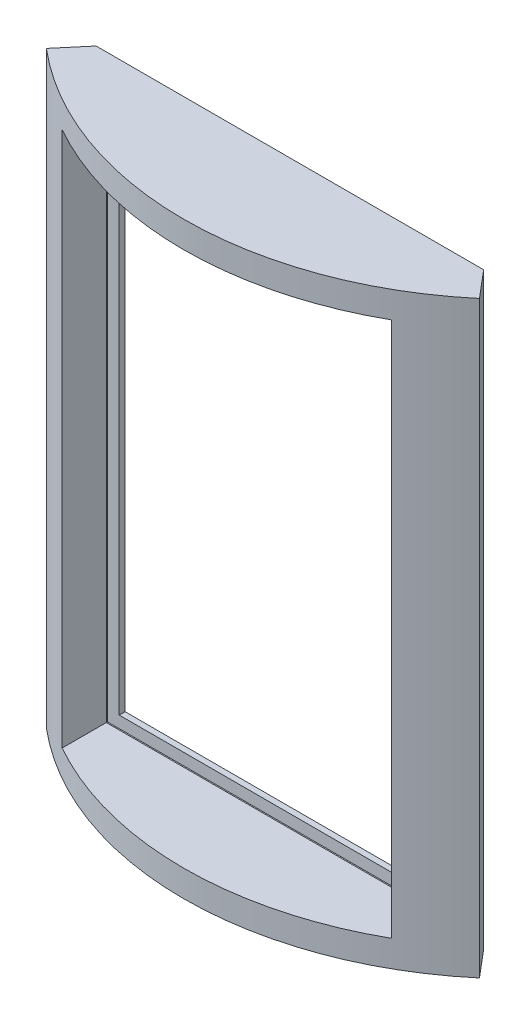
ISO-10303-21;
HEADER;
FILE_DESCRIPTION(('STEP AP214'),'2;1');
FILE_NAME('part.step','',(''),(''),'','','');
FILE_SCHEMA(('AUTOMOTIVE_DESIGN { 1 0 10303 214 1 1 1 1 }'));
ENDSEC;
DATA;
#1=APPLICATION_CONTEXT('core data for automotive mechanical design processes');
#2=APPLICATION_PROTOCOL_DEFINITION('international standard','automotive_design',2000,#1);
#3=PRODUCT_CONTEXT('',#1,'mechanical');
#4=PRODUCT('Part','Part','',(#3));
#5=PRODUCT_RELATED_PRODUCT_CATEGORY('part','',(#4));
#6=PRODUCT_DEFINITION_FORMATION('','',#4);
#7=PRODUCT_DEFINITION_CONTEXT('part definition',#1,'design');
#8=PRODUCT_DEFINITION('design','',#6,#7);
#9=PRODUCT_DEFINITION_SHAPE('','',#8);
#10=(LENGTH_UNIT() NAMED_UNIT(*) SI_UNIT(.MILLI.,.METRE.));
#11=(NAMED_UNIT(*) PLANE_ANGLE_UNIT() SI_UNIT($,.RADIAN.));
#12=(NAMED_UNIT(*) SI_UNIT($,.STERADIAN.) SOLID_ANGLE_UNIT());
#13=UNCERTAINTY_MEASURE_WITH_UNIT(LENGTH_MEASURE(1.E-05),#10,'distance_accuracy_value','');
#14=(GEOMETRIC_REPRESENTATION_CONTEXT(3) GLOBAL_UNCERTAINTY_ASSIGNED_CONTEXT((#13)) GLOBAL_UNIT_ASSIGNED_CONTEXT((#10,
#11,#12)) REPRESENTATION_CONTEXT('',''));
#15=CARTESIAN_POINT('',(0.,0.,0.));
#16=DIRECTION('',(0.,0.,1.));
#17=DIRECTION('',(1.,0.,0.));
#18=AXIS2_PLACEMENT_3D('',#15,#16,#17);
#19=CARTESIAN_POINT('',(-28.,-45.5,57.));
#20=DIRECTION('',(-1.,0.,0.));
#21=DIRECTION('',(0.,0.,1.));
#22=AXIS2_PLACEMENT_3D('',#19,#20,#21);
#23=PLANE('',#22);
#24=DIRECTION('',(0.,1.,0.));
#25=VECTOR('',#24,1.);
#26=CARTESIAN_POINT('',(-28.,-45.5,39.9492510220167));
#27=LINE('',#26,#25);
#28=CARTESIAN_POINT('',(-28.,-45.5,39.9492510220167));
#29=VERTEX_POINT('',#28);
#30=CARTESIAN_POINT('',(-28.,45.5,39.9492510220167));
#31=VERTEX_POINT('',#30);
#32=EDGE_CURVE('E61',#29,#31,#27,.T.);
#33=ORIENTED_EDGE('',*,*,#32,.F.);
#34=DIRECTION('',(0.,0.,-1.));
#35=VECTOR('',#34,1.);
#36=CARTESIAN_POINT('',(-28.,-45.5,57.));
#37=LINE('',#36,#35);
#38=CARTESIAN_POINT('',(-28.,-45.5,38.9492510220167));
#39=VERTEX_POINT('',#38);
#40=EDGE_CURVE('E245',#29,#39,#37,.T.);
#41=ORIENTED_EDGE('',*,*,#40,.T.);
#42=DIRECTION('',(0.,1.,0.));
#43=VECTOR('',#42,1.);
#44=CARTESIAN_POINT('',(-28.,-45.5,38.9492510220167));
#45=LINE('',#44,#43);
#46=CARTESIAN_POINT('',(-28.,45.5,38.9492510220167));
#47=VERTEX_POINT('',#46);
#48=EDGE_CURVE('E223',#39,#47,#45,.T.);
#49=ORIENTED_EDGE('',*,*,#48,.T.);
#50=DIRECTION('',(0.,0.,-1.));
#51=VECTOR('',#50,1.);
#52=CARTESIAN_POINT('',(-28.,45.5,57.));
#53=LINE('',#52,#51);
#54=EDGE_CURVE('E239',#31,#47,#53,.T.);
#55=ORIENTED_EDGE('',*,*,#54,.F.);
#56=EDGE_LOOP('',(#33,#41,#49,#55));
#57=FACE_BOUND('',#56,.T.);
#58=ADVANCED_FACE('F38',(#57),#23,.F.);
#59=CARTESIAN_POINT('',(28.,-45.5,57.));
#60=DIRECTION('',(0.,-1.,0.));
#61=DIRECTION('',(0.,0.,-1.));
#62=AXIS2_PLACEMENT_3D('',#59,#60,#61);
#63=PLANE('',#62);
#64=DIRECTION('',(-1.,0.,0.));
#65=VECTOR('',#64,1.);
#66=CARTESIAN_POINT('',(28.,-45.5,39.9492510220167));
#67=LINE('',#66,#65);
#68=CARTESIAN_POINT('',(28.,-45.5,39.9492510220167));
#69=VERTEX_POINT('',#68);
#70=EDGE_CURVE('E208',#69,#29,#67,.T.);
#71=ORIENTED_EDGE('',*,*,#70,.F.);
#72=DIRECTION('',(0.,0.,-1.));
#73=VECTOR('',#72,1.);
#74=CARTESIAN_POINT('',(28.,-45.5,57.));
#75=LINE('',#74,#73);
#76=CARTESIAN_POINT('',(28.,-45.5,38.9492510220167));
#77=VERTEX_POINT('',#76);
#78=EDGE_CURVE('E250',#69,#77,#75,.T.);
#79=ORIENTED_EDGE('',*,*,#78,.T.);
#80=DIRECTION('',(-1.,0.,0.));
#81=VECTOR('',#80,1.);
#82=CARTESIAN_POINT('',(28.,-45.5,38.9492510220167));
#83=LINE('',#82,#81);
#84=EDGE_CURVE('E235',#77,#39,#83,.T.);
#85=ORIENTED_EDGE('',*,*,#84,.T.);
#86=ORIENTED_EDGE('',*,*,#40,.F.);
#87=EDGE_LOOP('',(#71,#79,#85,#86));
#88=FACE_BOUND('',#87,.T.);
#89=ADVANCED_FACE('F338',(#88),#63,.F.);
#90=CARTESIAN_POINT('',(28.,-45.5,57.));
#91=DIRECTION('',(1.,0.,0.));
#92=DIRECTION('',(0.,0.,-1.));
#93=AXIS2_PLACEMENT_3D('',#90,#91,#92);
#94=PLANE('',#93);
#95=DIRECTION('',(0.,-1.,0.));
#96=VECTOR('',#95,1.);
#97=CARTESIAN_POINT('',(28.,-45.5,39.9492510220167));
#98=LINE('',#97,#96);
#99=CARTESIAN_POINT('',(28.,45.5,39.9492510220167));
#100=VERTEX_POINT('',#99);
#101=EDGE_CURVE('E200',#100,#69,#98,.T.);
#102=ORIENTED_EDGE('',*,*,#101,.F.);
#103=DIRECTION('',(0.,0.,-1.));
#104=VECTOR('',#103,1.);
#105=CARTESIAN_POINT('',(28.,45.5,57.));
#106=LINE('',#105,#104);
#107=CARTESIAN_POINT('',(28.,45.5,38.9492510220167));
#108=VERTEX_POINT('',#107);
#109=EDGE_CURVE('E255',#100,#108,#106,.T.);
#110=ORIENTED_EDGE('',*,*,#109,.T.);
#111=DIRECTION('',(0.,-1.,0.));
#112=VECTOR('',#111,1.);
#113=CARTESIAN_POINT('',(28.,-45.5,38.9492510220167));
#114=LINE('',#113,#112);
#115=EDGE_CURVE('E231',#108,#77,#114,.T.);
#116=ORIENTED_EDGE('',*,*,#115,.T.);
#117=ORIENTED_EDGE('',*,*,#78,.F.);
#118=EDGE_LOOP('',(#102,#110,#116,#117));
#119=FACE_BOUND('',#118,.T.);
#120=ADVANCED_FACE('F323',(#119),#94,.F.);
#121=CARTESIAN_POINT('',(28.,45.5,57.));
#122=DIRECTION('',(0.,1.,0.));
#123=DIRECTION('',(0.,0.,1.));
#124=AXIS2_PLACEMENT_3D('',#121,#122,#123);
#125=PLANE('',#124);
#126=DIRECTION('',(1.,0.,0.));
#127=VECTOR('',#126,1.);
#128=CARTESIAN_POINT('',(28.,45.5,39.9492510220167));
#129=LINE('',#128,#127);
#130=EDGE_CURVE('E47',#31,#100,#129,.T.);
#131=ORIENTED_EDGE('',*,*,#130,.F.);
#132=ORIENTED_EDGE('',*,*,#54,.T.);
#133=DIRECTION('',(1.,0.,0.));
#134=VECTOR('',#133,1.);
#135=CARTESIAN_POINT('',(28.,45.5,38.9492510220167));
#136=LINE('',#135,#134);
#137=EDGE_CURVE('E227',#47,#108,#136,.T.);
#138=ORIENTED_EDGE('',*,*,#137,.T.);
#139=ORIENTED_EDGE('',*,*,#109,.F.);
#140=EDGE_LOOP('',(#131,#132,#138,#139));
#141=FACE_BOUND('',#140,.T.);
#142=ADVANCED_FACE('F324',(#141),#125,.F.);
#143=CARTESIAN_POINT('',(0.,50.,0.));
#144=DIRECTION('',(0.,-1.,0.));
#145=DIRECTION('',(0.,0.,-1.));
#146=AXIS2_PLACEMENT_3D('',#143,#144,#145);
#147=CYLINDRICAL_SURFACE('',#146,57.);
#148=DIRECTION('',(0.,-1.,0.));
#149=VECTOR('',#148,1.);
#150=CARTESIAN_POINT('',(28.,50.,49.6487663492256));
#151=LINE('',#150,#149);
#152=CARTESIAN_POINT('',(28.,45.5,49.6487663492256));
#153=VERTEX_POINT('',#152);
#154=CARTESIAN_POINT('',(28.,-45.5,49.6487663492256));
#155=VERTEX_POINT('',#154);
#156=EDGE_CURVE('E262',#153,#155,#151,.T.);
#157=ORIENTED_EDGE('',*,*,#156,.T.);
#158=CARTESIAN_POINT('',(0.,-45.5,0.));
#159=DIRECTION('',(0.,-1.,0.));
#160=DIRECTION('',(0.,0.,-1.));
#161=AXIS2_PLACEMENT_3D('',#158,#159,#160);
#162=CIRCLE('',#161,57.);
#163=CARTESIAN_POINT('',(-28.,-45.5,49.6487663492257));
#164=VERTEX_POINT('',#163);
#165=EDGE_CURVE('E266',#155,#164,#162,.T.);
#166=ORIENTED_EDGE('',*,*,#165,.T.);
#167=DIRECTION('',(0.,-1.,0.));
#168=VECTOR('',#167,1.);
#169=CARTESIAN_POINT('',(-28.,50.,49.6487663492257));
#170=LINE('',#169,#168);
#171=CARTESIAN_POINT('',(-28.,45.5,49.6487663492257));
#172=VERTEX_POINT('',#171);
#173=EDGE_CURVE('E269',#164,#172,#170,.F.);
#174=ORIENTED_EDGE('',*,*,#173,.T.);
#175=CARTESIAN_POINT('',(0.,45.5,0.));
#176=DIRECTION('',(0.,1.,0.));
#177=DIRECTION('',(0.,0.,1.));
#178=AXIS2_PLACEMENT_3D('',#175,#176,#177);
#179=CIRCLE('',#178,57.);
#180=EDGE_CURVE('E244',#172,#153,#179,.T.);
#181=ORIENTED_EDGE('',*,*,#180,.T.);
#182=EDGE_LOOP('',(#157,#166,#174,#181));
#183=FACE_BOUND('',#182,.T.);
#184=CARTESIAN_POINT('',(0.,-50.,0.));
#185=DIRECTION('',(0.,1.,0.));
#186=DIRECTION('',(0.,0.,1.));
#187=AXIS2_PLACEMENT_3D('',#184,#185,#186);
#188=CIRCLE('',#187,57.);
#189=CARTESIAN_POINT('',(-36.7968358417331,-50.,43.5315158481363));
#190=VERTEX_POINT('',#189);
#191=CARTESIAN_POINT('',(36.7968358417331,-50.,43.5315158481363));
#192=VERTEX_POINT('',#191);
#193=EDGE_CURVE('E273',#190,#192,#188,.T.);
#194=ORIENTED_EDGE('',*,*,#193,.T.);
#195=DIRECTION('',(0.,-1.,0.));
#196=VECTOR('',#195,1.);
#197=CARTESIAN_POINT('',(36.7968358417331,50.,43.5315158481363));
#198=LINE('',#197,#196);
#199=CARTESIAN_POINT('',(36.7968358417331,50.,43.5315158481363));
#200=VERTEX_POINT('',#199);
#201=EDGE_CURVE('E311',#200,#192,#198,.T.);
#202=ORIENTED_EDGE('',*,*,#201,.F.);
#203=CARTESIAN_POINT('',(0.,50.,0.));
#204=DIRECTION('',(0.,1.,0.));
#205=DIRECTION('',(0.,0.,1.));
#206=AXIS2_PLACEMENT_3D('',#203,#204,#205);
#207=CIRCLE('',#206,57.);
#208=CARTESIAN_POINT('',(-36.7968358417331,50.,43.5315158481363));
#209=VERTEX_POINT('',#208);
#210=EDGE_CURVE('E274',#209,#200,#207,.T.);
#211=ORIENTED_EDGE('',*,*,#210,.F.);
#212=DIRECTION('',(0.,-1.,0.));
#213=VECTOR('',#212,1.);
#214=CARTESIAN_POINT('',(-36.7968358417331,50.,43.5315158481363));
#215=LINE('',#214,#213);
#216=EDGE_CURVE('E288',#209,#190,#215,.T.);
#217=ORIENTED_EDGE('',*,*,#216,.T.);
#218=EDGE_LOOP('',(#194,#202,#211,#217));
#219=FACE_BOUND('',#218,.T.);
#220=ADVANCED_FACE('F40',(#183,#219),#147,.T.);
#221=CARTESIAN_POINT('',(32.9234847004981,50.,38.9492510220167));
#222=DIRECTION('',(-0.763710804353268,0.,0.645558523539179));
#223=DIRECTION('',(0.645558523539179,0.,0.763710804353268));
#224=AXIS2_PLACEMENT_3D('',#221,#222,#223);
#225=PLANE('',#224);
#226=DIRECTION('',(-0.645558523539179,0.,-0.763710804353267));
#227=VECTOR('',#226,1.);
#228=CARTESIAN_POINT('',(32.9234847004981,-50.,38.9492510220167));
#229=LINE('',#228,#227);
#230=CARTESIAN_POINT('',(32.9234847004981,-50.,38.9492510220167));
#231=VERTEX_POINT('',#230);
#232=EDGE_CURVE('E292',#192,#231,#229,.T.);
#233=ORIENTED_EDGE('',*,*,#232,.T.);
#234=DIRECTION('',(0.,-1.,0.));
#235=VECTOR('',#234,1.);
#236=CARTESIAN_POINT('',(32.9234847004981,50.,38.9492510220167));
#237=LINE('',#236,#235);
#238=CARTESIAN_POINT('',(32.9234847004981,50.,38.9492510220167));
#239=VERTEX_POINT('',#238);
#240=EDGE_CURVE('E307',#239,#231,#237,.T.);
#241=ORIENTED_EDGE('',*,*,#240,.F.);
#242=DIRECTION('',(-0.645558523539179,0.,-0.763710804353267));
#243=VECTOR('',#242,1.);
#244=CARTESIAN_POINT('',(32.9234847004981,50.,38.9492510220167));
#245=LINE('',#244,#243);
#246=EDGE_CURVE('E278',#200,#239,#245,.T.);
#247=ORIENTED_EDGE('',*,*,#246,.F.);
#248=ORIENTED_EDGE('',*,*,#201,.T.);
#249=EDGE_LOOP('',(#233,#241,#247,#248));
#250=FACE_BOUND('',#249,.T.);
#251=ADVANCED_FACE('F498',(#250),#225,.F.);
#252=CARTESIAN_POINT('',(-32.9234847004981,50.,38.9492510220167));
#253=DIRECTION('',(0.,0.,1.));
#254=DIRECTION('',(1.,0.,0.));
#255=AXIS2_PLACEMENT_3D('',#252,#253,#254);
#256=PLANE('',#255);
#257=ORIENTED_EDGE('',*,*,#137,.F.);
#258=ORIENTED_EDGE('',*,*,#48,.F.);
#259=ORIENTED_EDGE('',*,*,#84,.F.);
#260=ORIENTED_EDGE('',*,*,#115,.F.);
#261=EDGE_LOOP('',(#257,#258,#259,#260));
#262=FACE_BOUND('',#261,.T.);
#263=DIRECTION('',(-1.,0.,0.));
#264=VECTOR('',#263,1.);
#265=CARTESIAN_POINT('',(-32.9234847004981,-50.,38.9492510220167));
#266=LINE('',#265,#264);
#267=CARTESIAN_POINT('',(-32.9234847004981,-50.,38.9492510220167));
#268=VERTEX_POINT('',#267);
#269=EDGE_CURVE('E295',#231,#268,#266,.T.);
#270=ORIENTED_EDGE('',*,*,#269,.T.);
#271=DIRECTION('',(0.,-1.,0.));
#272=VECTOR('',#271,1.);
#273=CARTESIAN_POINT('',(-32.9234847004981,50.,38.9492510220167));
#274=LINE('',#273,#272);
#275=CARTESIAN_POINT('',(-32.9234847004981,50.,38.9492510220167));
#276=VERTEX_POINT('',#275);
#277=EDGE_CURVE('E303',#276,#268,#274,.T.);
#278=ORIENTED_EDGE('',*,*,#277,.F.);
#279=DIRECTION('',(-1.,0.,0.));
#280=VECTOR('',#279,1.);
#281=CARTESIAN_POINT('',(-32.9234847004981,50.,38.9492510220167));
#282=LINE('',#281,#280);
#283=EDGE_CURVE('E282',#239,#276,#282,.T.);
#284=ORIENTED_EDGE('',*,*,#283,.F.);
#285=ORIENTED_EDGE('',*,*,#240,.T.);
#286=EDGE_LOOP('',(#270,#278,#284,#285));
#287=FACE_BOUND('',#286,.T.);
#288=ADVANCED_FACE('F335',(#262,#287),#256,.F.);
#289=CARTESIAN_POINT('',(-36.7968358417331,50.,43.5315158481363));
#290=DIRECTION('',(0.763710804353269,0.,0.645558523539178));
#291=DIRECTION('',(0.645558523539178,0.,-0.763710804353269));
#292=AXIS2_PLACEMENT_3D('',#289,#290,#291);
#293=PLANE('',#292);
#294=DIRECTION('',(-0.645558523539178,0.,0.763710804353269));
#295=VECTOR('',#294,1.);
#296=CARTESIAN_POINT('',(-36.7968358417331,-50.,43.5315158481363));
#297=LINE('',#296,#295);
#298=EDGE_CURVE('E279',#268,#190,#297,.T.);
#299=ORIENTED_EDGE('',*,*,#298,.T.);
#300=ORIENTED_EDGE('',*,*,#216,.F.);
#301=DIRECTION('',(-0.645558523539178,0.,0.763710804353269));
#302=VECTOR('',#301,1.);
#303=CARTESIAN_POINT('',(-36.7968358417331,50.,43.5315158481363));
#304=LINE('',#303,#302);
#305=EDGE_CURVE('E285',#276,#209,#304,.T.);
#306=ORIENTED_EDGE('',*,*,#305,.F.);
#307=ORIENTED_EDGE('',*,*,#277,.T.);
#308=EDGE_LOOP('',(#299,#300,#306,#307));
#309=FACE_BOUND('',#308,.T.);
#310=ADVANCED_FACE('F481',(#309),#293,.F.);
#311=CARTESIAN_POINT('',(0.,50.,0.));
#312=DIRECTION('',(0.,1.,0.));
#313=DIRECTION('',(0.,0.,1.));
#314=AXIS2_PLACEMENT_3D('',#311,#312,#313);
#315=PLANE('',#314);
#316=ORIENTED_EDGE('',*,*,#210,.T.);
#317=ORIENTED_EDGE('',*,*,#246,.T.);
#318=ORIENTED_EDGE('',*,*,#283,.T.);
#319=ORIENTED_EDGE('',*,*,#305,.T.);
#320=EDGE_LOOP('',(#316,#317,#318,#319));
#321=FACE_BOUND('',#320,.T.);
#322=ADVANCED_FACE('F471',(#321),#315,.T.);
#323=CARTESIAN_POINT('',(0.,-50.,0.));
#324=DIRECTION('',(0.,1.,0.));
#325=DIRECTION('',(0.,0.,1.));
#326=AXIS2_PLACEMENT_3D('',#323,#324,#325);
#327=PLANE('',#326);
#328=ORIENTED_EDGE('',*,*,#193,.F.);
#329=ORIENTED_EDGE('',*,*,#298,.F.);
#330=ORIENTED_EDGE('',*,*,#269,.F.);
#331=ORIENTED_EDGE('',*,*,#232,.F.);
#332=EDGE_LOOP('',(#328,#329,#330,#331));
#333=FACE_BOUND('',#332,.T.);
#334=ADVANCED_FACE('F360',(#333),#327,.F.);
#335=CARTESIAN_POINT('',(-28.,-45.5,42.1492510220167));
#336=VERTEX_POINT('',#335);
#337=EDGE_CURVE('E240',#164,#336,#37,.T.);
#338=ORIENTED_EDGE('',*,*,#337,.T.);
#339=DIRECTION('',(0.,1.,0.));
#340=VECTOR('',#339,1.);
#341=CARTESIAN_POINT('',(-28.,-45.5,42.1492510220167));
#342=LINE('',#341,#340);
#343=CARTESIAN_POINT('',(-28.,45.5,42.1492510220167));
#344=VERTEX_POINT('',#343);
#345=EDGE_CURVE('E219',#336,#344,#342,.T.);
#346=ORIENTED_EDGE('',*,*,#345,.T.);
#347=EDGE_CURVE('E256',#172,#344,#53,.T.);
#348=ORIENTED_EDGE('',*,*,#347,.F.);
#349=ORIENTED_EDGE('',*,*,#173,.F.);
#350=EDGE_LOOP('',(#338,#346,#348,#349));
#351=FACE_BOUND('',#350,.T.);
#352=ADVANCED_FACE('F350',(#351),#23,.F.);
#353=CARTESIAN_POINT('',(28.,-45.5,42.1492510220167));
#354=VERTEX_POINT('',#353);
#355=EDGE_CURVE('E246',#155,#354,#75,.T.);
#356=ORIENTED_EDGE('',*,*,#355,.T.);
#357=DIRECTION('',(-1.,0.,0.));
#358=VECTOR('',#357,1.);
#359=CARTESIAN_POINT('',(28.,-45.5,42.1492510220167));
#360=LINE('',#359,#358);
#361=EDGE_CURVE('E215',#354,#336,#360,.T.);
#362=ORIENTED_EDGE('',*,*,#361,.T.);
#363=ORIENTED_EDGE('',*,*,#337,.F.);
#364=ORIENTED_EDGE('',*,*,#165,.F.);
#365=EDGE_LOOP('',(#356,#362,#363,#364));
#366=FACE_BOUND('',#365,.T.);
#367=ADVANCED_FACE('F342',(#366),#63,.F.);
#368=CARTESIAN_POINT('',(28.,45.5,42.1492510220167));
#369=VERTEX_POINT('',#368);
#370=EDGE_CURVE('E251',#153,#369,#106,.T.);
#371=ORIENTED_EDGE('',*,*,#370,.T.);
#372=DIRECTION('',(0.,-1.,0.));
#373=VECTOR('',#372,1.);
#374=CARTESIAN_POINT('',(28.,-45.5,42.1492510220167));
#375=LINE('',#374,#373);
#376=EDGE_CURVE('E54',#369,#354,#375,.T.);
#377=ORIENTED_EDGE('',*,*,#376,.T.);
#378=ORIENTED_EDGE('',*,*,#355,.F.);
#379=ORIENTED_EDGE('',*,*,#156,.F.);
#380=EDGE_LOOP('',(#371,#377,#378,#379));
#381=FACE_BOUND('',#380,.T.);
#382=ADVANCED_FACE('F348',(#381),#94,.F.);
#383=ORIENTED_EDGE('',*,*,#347,.T.);
#384=DIRECTION('',(1.,0.,0.));
#385=VECTOR('',#384,1.);
#386=CARTESIAN_POINT('',(28.,45.5,42.1492510220167));
#387=LINE('',#386,#385);
#388=EDGE_CURVE('E11',#344,#369,#387,.T.);
#389=ORIENTED_EDGE('',*,*,#388,.T.);
#390=ORIENTED_EDGE('',*,*,#370,.F.);
#391=ORIENTED_EDGE('',*,*,#180,.F.);
#392=EDGE_LOOP('',(#383,#389,#390,#391));
#393=FACE_BOUND('',#392,.T.);
#394=ADVANCED_FACE('F358',(#393),#125,.F.);
#395=CARTESIAN_POINT('',(0.,0.,42.1492510220167));
#396=DIRECTION('',(0.,0.,1.));
#397=DIRECTION('',(1.,0.,0.));
#398=AXIS2_PLACEMENT_3D('',#395,#396,#397);
#399=PLANE('',#398);
#400=DIRECTION('',(0.,1.,0.));
#401=VECTOR('',#400,1.);
#402=CARTESIAN_POINT('',(-30.,-47.5,42.1492510220167));
#403=LINE('',#402,#401);
#404=CARTESIAN_POINT('',(-30.,-47.5,42.1492510220167));
#405=VERTEX_POINT('',#404);
#406=CARTESIAN_POINT('',(-30.,47.5,42.1492510220167));
#407=VERTEX_POINT('',#406);
#408=EDGE_CURVE('E155',#405,#407,#403,.T.);
#409=ORIENTED_EDGE('',*,*,#408,.T.);
#410=DIRECTION('',(1.,0.,0.));
#411=VECTOR('',#410,1.);
#412=CARTESIAN_POINT('',(30.,47.5,42.1492510220167));
#413=LINE('',#412,#411);
#414=CARTESIAN_POINT('',(30.,47.5,42.1492510220167));
#415=VERTEX_POINT('',#414);
#416=EDGE_CURVE('E167',#407,#415,#413,.T.);
#417=ORIENTED_EDGE('',*,*,#416,.T.);
#418=DIRECTION('',(0.,-1.,0.));
#419=VECTOR('',#418,1.);
#420=CARTESIAN_POINT('',(30.,-47.5,42.1492510220167));
#421=LINE('',#420,#419);
#422=CARTESIAN_POINT('',(30.,-47.5,42.1492510220167));
#423=VERTEX_POINT('',#422);
#424=EDGE_CURVE('E173',#415,#423,#421,.T.);
#425=ORIENTED_EDGE('',*,*,#424,.T.);
#426=DIRECTION('',(-1.,0.,0.));
#427=VECTOR('',#426,1.);
#428=CARTESIAN_POINT('',(30.,-47.5,42.1492510220167));
#429=LINE('',#428,#427);
#430=EDGE_CURVE('E164',#423,#405,#429,.T.);
#431=ORIENTED_EDGE('',*,*,#430,.T.);
#432=EDGE_LOOP('',(#409,#417,#425,#431));
#433=FACE_BOUND('',#432,.T.);
#434=ORIENTED_EDGE('',*,*,#361,.F.);
#435=ORIENTED_EDGE('',*,*,#376,.F.);
#436=ORIENTED_EDGE('',*,*,#388,.F.);
#437=ORIENTED_EDGE('',*,*,#345,.F.);
#438=EDGE_LOOP('',(#434,#435,#436,#437));
#439=FACE_BOUND('',#438,.T.);
#440=ADVANCED_FACE('F175',(#433,#439),#399,.F.);
#441=CARTESIAN_POINT('',(0.,0.,39.9492510220167));
#442=DIRECTION('',(0.,0.,1.));
#443=DIRECTION('',(1.,0.,0.));
#444=AXIS2_PLACEMENT_3D('',#441,#442,#443);
#445=PLANE('',#444);
#446=DIRECTION('',(0.,1.,0.));
#447=VECTOR('',#446,1.);
#448=CARTESIAN_POINT('',(-30.,-47.5,39.9492510220167));
#449=LINE('',#448,#447);
#450=CARTESIAN_POINT('',(-30.,-47.5,39.9492510220167));
#451=VERTEX_POINT('',#450);
#452=CARTESIAN_POINT('',(-30.,47.5,39.9492510220167));
#453=VERTEX_POINT('',#452);
#454=EDGE_CURVE('E158',#451,#453,#449,.T.);
#455=ORIENTED_EDGE('',*,*,#454,.F.);
#456=DIRECTION('',(-1.,0.,0.));
#457=VECTOR('',#456,1.);
#458=CARTESIAN_POINT('',(30.,-47.5,39.9492510220167));
#459=LINE('',#458,#457);
#460=CARTESIAN_POINT('',(30.,-47.5,39.9492510220167));
#461=VERTEX_POINT('',#460);
#462=EDGE_CURVE('E178',#461,#451,#459,.T.);
#463=ORIENTED_EDGE('',*,*,#462,.F.);
#464=DIRECTION('',(0.,-1.,0.));
#465=VECTOR('',#464,1.);
#466=CARTESIAN_POINT('',(30.,-47.5,39.9492510220167));
#467=LINE('',#466,#465);
#468=CARTESIAN_POINT('',(30.,47.5,39.9492510220167));
#469=VERTEX_POINT('',#468);
#470=EDGE_CURVE('E182',#469,#461,#467,.T.);
#471=ORIENTED_EDGE('',*,*,#470,.F.);
#472=DIRECTION('',(1.,0.,0.));
#473=VECTOR('',#472,1.);
#474=CARTESIAN_POINT('',(30.,47.5,39.9492510220167));
#475=LINE('',#474,#473);
#476=EDGE_CURVE('E191',#453,#469,#475,.T.);
#477=ORIENTED_EDGE('',*,*,#476,.F.);
#478=EDGE_LOOP('',(#455,#463,#471,#477));
#479=FACE_BOUND('',#478,.T.);
#480=ORIENTED_EDGE('',*,*,#32,.T.);
#481=ORIENTED_EDGE('',*,*,#130,.T.);
#482=ORIENTED_EDGE('',*,*,#101,.T.);
#483=ORIENTED_EDGE('',*,*,#70,.T.);
#484=EDGE_LOOP('',(#480,#481,#482,#483));
#485=FACE_BOUND('',#484,.T.);
#486=ADVANCED_FACE('F316',(#479,#485),#445,.T.);
#487=CARTESIAN_POINT('',(-30.,-47.5,42.1492510220167));
#488=DIRECTION('',(-1.,0.,0.));
#489=DIRECTION('',(0.,0.,1.));
#490=AXIS2_PLACEMENT_3D('',#487,#488,#489);
#491=PLANE('',#490);
#492=ORIENTED_EDGE('',*,*,#454,.T.);
#493=DIRECTION('',(0.,0.,-1.));
#494=VECTOR('',#493,1.);
#495=CARTESIAN_POINT('',(-30.,47.5,42.1492510220167));
#496=LINE('',#495,#494);
#497=EDGE_CURVE('E151',#407,#453,#496,.T.);
#498=ORIENTED_EDGE('',*,*,#497,.F.);
#499=ORIENTED_EDGE('',*,*,#408,.F.);
#500=DIRECTION('',(0.,0.,-1.));
#501=VECTOR('',#500,1.);
#502=CARTESIAN_POINT('',(-30.,-47.5,42.1492510220167));
#503=LINE('',#502,#501);
#504=EDGE_CURVE('E197',#405,#451,#503,.T.);
#505=ORIENTED_EDGE('',*,*,#504,.T.);
#506=EDGE_LOOP('',(#492,#498,#499,#505));
#507=FACE_BOUND('',#506,.T.);
#508=ADVANCED_FACE('F153',(#507),#491,.F.);
#509=CARTESIAN_POINT('',(30.,-47.5,42.1492510220167));
#510=DIRECTION('',(0.,-1.,0.));
#511=DIRECTION('',(0.,0.,-1.));
#512=AXIS2_PLACEMENT_3D('',#509,#510,#511);
#513=PLANE('',#512);
#514=ORIENTED_EDGE('',*,*,#462,.T.);
#515=ORIENTED_EDGE('',*,*,#504,.F.);
#516=ORIENTED_EDGE('',*,*,#430,.F.);
#517=DIRECTION('',(0.,0.,-1.));
#518=VECTOR('',#517,1.);
#519=CARTESIAN_POINT('',(30.,-47.5,42.1492510220167));
#520=LINE('',#519,#518);
#521=EDGE_CURVE('E201',#423,#461,#520,.T.);
#522=ORIENTED_EDGE('',*,*,#521,.T.);
#523=EDGE_LOOP('',(#514,#515,#516,#522));
#524=FACE_BOUND('',#523,.T.);
#525=ADVANCED_FACE('F381',(#524),#513,.F.);
#526=CARTESIAN_POINT('',(30.,-47.5,42.1492510220167));
#527=DIRECTION('',(1.,0.,0.));
#528=DIRECTION('',(0.,0.,-1.));
#529=AXIS2_PLACEMENT_3D('',#526,#527,#528);
#530=PLANE('',#529);
#531=ORIENTED_EDGE('',*,*,#470,.T.);
#532=ORIENTED_EDGE('',*,*,#521,.F.);
#533=ORIENTED_EDGE('',*,*,#424,.F.);
#534=DIRECTION('',(0.,0.,-1.));
#535=VECTOR('',#534,1.);
#536=CARTESIAN_POINT('',(30.,47.5,42.1492510220167));
#537=LINE('',#536,#535);
#538=EDGE_CURVE('E163',#415,#469,#537,.T.);
#539=ORIENTED_EDGE('',*,*,#538,.T.);
#540=EDGE_LOOP('',(#531,#532,#533,#539));
#541=FACE_BOUND('',#540,.T.);
#542=ADVANCED_FACE('F384',(#541),#530,.F.);
#543=CARTESIAN_POINT('',(30.,47.5,42.1492510220167));
#544=DIRECTION('',(0.,1.,0.));
#545=DIRECTION('',(0.,0.,1.));
#546=AXIS2_PLACEMENT_3D('',#543,#544,#545);
#547=PLANE('',#546);
#548=ORIENTED_EDGE('',*,*,#476,.T.);
#549=ORIENTED_EDGE('',*,*,#538,.F.);
#550=ORIENTED_EDGE('',*,*,#416,.F.);
#551=ORIENTED_EDGE('',*,*,#497,.T.);
#552=EDGE_LOOP('',(#548,#549,#550,#551));
#553=FACE_BOUND('',#552,.T.);
#554=ADVANCED_FACE('F168',(#553),#547,.F.);
#555=CLOSED_SHELL('',(#58,#89,#120,#142,#220,#251,#288,#310,#322,#334,#352,#367,#382,#394,#440,
#486,#508,#525,#542,#554));
#556=MANIFOLD_SOLID_BREP('B2',#555);
#557=ADVANCED_BREP_SHAPE_REPRESENTATION('',(#18,#556),#14);
#558=SHAPE_DEFINITION_REPRESENTATION(#9,#557);
ENDSEC;
END-ISO-10303-21;
